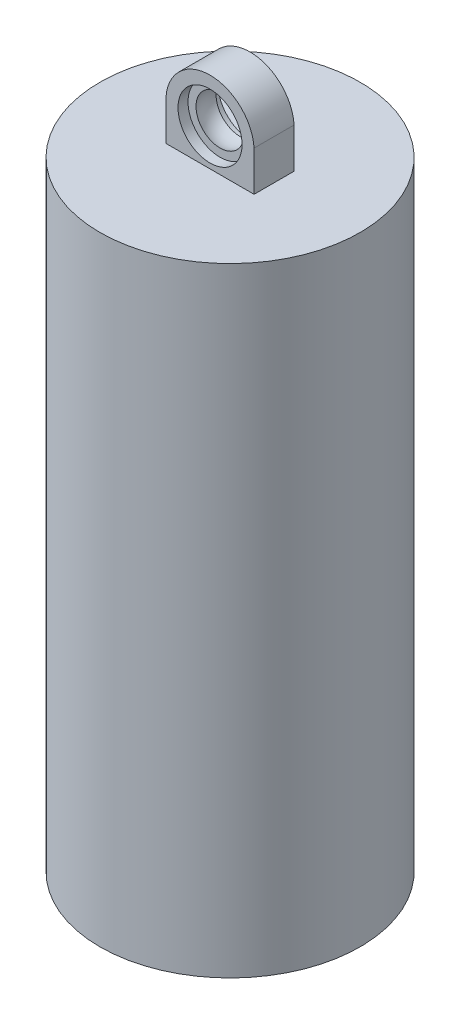
ISO-10303-21;
HEADER;
FILE_DESCRIPTION(('STEP AP214'),'2;1');
FILE_NAME('part.step','',(''),(''),'','','');
FILE_SCHEMA(('AUTOMOTIVE_DESIGN { 1 0 10303 214 1 1 1 1 }'));
ENDSEC;
DATA;
#1=APPLICATION_CONTEXT('core data for automotive mechanical design processes');
#2=APPLICATION_PROTOCOL_DEFINITION('international standard','automotive_design',2000,#1);
#3=PRODUCT_CONTEXT('',#1,'mechanical');
#4=PRODUCT('Part','Part','',(#3));
#5=PRODUCT_RELATED_PRODUCT_CATEGORY('part','',(#4));
#6=PRODUCT_DEFINITION_FORMATION('','',#4);
#7=PRODUCT_DEFINITION_CONTEXT('part definition',#1,'design');
#8=PRODUCT_DEFINITION('design','',#6,#7);
#9=PRODUCT_DEFINITION_SHAPE('','',#8);
#10=(LENGTH_UNIT() NAMED_UNIT(*) SI_UNIT(.MILLI.,.METRE.));
#11=(NAMED_UNIT(*) PLANE_ANGLE_UNIT() SI_UNIT($,.RADIAN.));
#12=(NAMED_UNIT(*) SI_UNIT($,.STERADIAN.) SOLID_ANGLE_UNIT());
#13=UNCERTAINTY_MEASURE_WITH_UNIT(LENGTH_MEASURE(1.E-05),#10,'distance_accuracy_value','');
#14=(GEOMETRIC_REPRESENTATION_CONTEXT(3) GLOBAL_UNCERTAINTY_ASSIGNED_CONTEXT((#13)) GLOBAL_UNIT_ASSIGNED_CONTEXT((#10,
#11,#12)) REPRESENTATION_CONTEXT('',''));
#15=CARTESIAN_POINT('',(0.,0.,0.));
#16=DIRECTION('',(0.,0.,1.));
#17=DIRECTION('',(1.,0.,0.));
#18=AXIS2_PLACEMENT_3D('',#15,#16,#17);
#19=CARTESIAN_POINT('',(0.,163.761335751218,-5.));
#20=DIRECTION('',(0.,0.,1.));
#21=DIRECTION('',(1.,0.,0.));
#22=AXIS2_PLACEMENT_3D('',#19,#20,#21);
#23=CYLINDRICAL_SURFACE('',#22,8.);
#24=CARTESIAN_POINT('',(0.,163.761335751218,-5.));
#25=DIRECTION('',(0.,0.,1.));
#26=DIRECTION('',(1.,0.,0.));
#27=AXIS2_PLACEMENT_3D('',#24,#25,#26);
#28=CIRCLE('',#27,8.);
#29=CARTESIAN_POINT('',(8.00000000000001,163.761335751218,-5.));
#30=VERTEX_POINT('',#29);
#31=EDGE_CURVE('E119',#30,#30,#28,.T.);
#32=ORIENTED_EDGE('',*,*,#31,.F.);
#33=EDGE_LOOP('',(#32));
#34=FACE_BOUND('',#33,.T.);
#35=CARTESIAN_POINT('',(0.,163.761335751218,-2.5));
#36=DIRECTION('',(0.,0.,1.));
#37=DIRECTION('',(1.,0.,0.));
#38=AXIS2_PLACEMENT_3D('',#35,#36,#37);
#39=CIRCLE('',#38,8.);
#40=CARTESIAN_POINT('',(8.00000000000001,163.761335751218,-2.5));
#41=VERTEX_POINT('',#40);
#42=EDGE_CURVE('E12',#41,#41,#39,.F.);
#43=ORIENTED_EDGE('',*,*,#42,.F.);
#44=EDGE_LOOP('',(#43));
#45=FACE_BOUND('',#44,.T.);
#46=ADVANCED_FACE('F44',(#34,#45),#23,.F.);
#47=CARTESIAN_POINT('',(0.,154.5,0.));
#48=DIRECTION('',(0.,-1.,0.));
#49=DIRECTION('',(0.,0.,-1.));
#50=AXIS2_PLACEMENT_3D('',#47,#48,#49);
#51=CYLINDRICAL_SURFACE('',#50,32.5);
#52=CARTESIAN_POINT('',(0.,154.5,0.));
#53=DIRECTION('',(0.,1.,0.));
#54=DIRECTION('',(0.,0.,1.));
#55=AXIS2_PLACEMENT_3D('',#52,#53,#54);
#56=CIRCLE('',#55,32.5);
#57=CARTESIAN_POINT('',(0.,154.5,32.5));
#58=VERTEX_POINT('',#57);
#59=EDGE_CURVE('E139',#58,#58,#56,.T.);
#60=ORIENTED_EDGE('',*,*,#59,.F.);
#61=EDGE_LOOP('',(#60));
#62=FACE_BOUND('',#61,.T.);
#63=CARTESIAN_POINT('',(0.,0.,0.));
#64=DIRECTION('',(0.,1.,0.));
#65=DIRECTION('',(0.,0.,1.));
#66=AXIS2_PLACEMENT_3D('',#63,#64,#65);
#67=CIRCLE('',#66,32.5);
#68=CARTESIAN_POINT('',(0.,0.,32.5));
#69=VERTEX_POINT('',#68);
#70=EDGE_CURVE('E136',#69,#69,#67,.T.);
#71=ORIENTED_EDGE('',*,*,#70,.T.);
#72=EDGE_LOOP('',(#71));
#73=FACE_BOUND('',#72,.T.);
#74=ADVANCED_FACE('F46',(#62,#73),#51,.T.);
#75=CARTESIAN_POINT('',(0.,154.5,0.));
#76=DIRECTION('',(0.,1.,0.));
#77=DIRECTION('',(0.,0.,1.));
#78=AXIS2_PLACEMENT_3D('',#75,#76,#77);
#79=PLANE('',#78);
#80=DIRECTION('',(1.,0.,0.));
#81=VECTOR('',#80,1.);
#82=CARTESIAN_POINT('',(-11.,154.5,5.));
#83=LINE('',#82,#81);
#84=CARTESIAN_POINT('',(-11.,154.5,5.));
#85=VERTEX_POINT('',#84);
#86=CARTESIAN_POINT('',(11.,154.5,5.));
#87=VERTEX_POINT('',#86);
#88=EDGE_CURVE('E59',#85,#87,#83,.T.);
#89=ORIENTED_EDGE('',*,*,#88,.F.);
#90=DIRECTION('',(0.,0.,1.));
#91=VECTOR('',#90,1.);
#92=CARTESIAN_POINT('',(-11.,154.5,-5.));
#93=LINE('',#92,#91);
#94=CARTESIAN_POINT('',(-11.,154.5,-5.));
#95=VERTEX_POINT('',#94);
#96=EDGE_CURVE('E102',#95,#85,#93,.T.);
#97=ORIENTED_EDGE('',*,*,#96,.F.);
#98=DIRECTION('',(1.,0.,0.));
#99=VECTOR('',#98,1.);
#100=CARTESIAN_POINT('',(-11.,154.5,-5.));
#101=LINE('',#100,#99);
#102=CARTESIAN_POINT('',(11.,154.5,-5.));
#103=VERTEX_POINT('',#102);
#104=EDGE_CURVE('E90',#95,#103,#101,.T.);
#105=ORIENTED_EDGE('',*,*,#104,.T.);
#106=DIRECTION('',(0.,0.,1.));
#107=VECTOR('',#106,1.);
#108=CARTESIAN_POINT('',(11.,154.5,-5.));
#109=LINE('',#108,#107);
#110=EDGE_CURVE('E95',#103,#87,#109,.T.);
#111=ORIENTED_EDGE('',*,*,#110,.T.);
#112=EDGE_LOOP('',(#89,#97,#105,#111));
#113=FACE_BOUND('',#112,.T.);
#114=ORIENTED_EDGE('',*,*,#59,.T.);
#115=EDGE_LOOP('',(#114));
#116=FACE_BOUND('',#115,.T.);
#117=ADVANCED_FACE('F108',(#113,#116),#79,.T.);
#118=CARTESIAN_POINT('',(0.,0.,0.));
#119=DIRECTION('',(0.,1.,0.));
#120=DIRECTION('',(0.,0.,1.));
#121=AXIS2_PLACEMENT_3D('',#118,#119,#120);
#122=PLANE('',#121);
#123=CARTESIAN_POINT('',(0.,0.,0.));
#124=DIRECTION('',(0.,-1.,0.));
#125=DIRECTION('',(0.,0.,-1.));
#126=AXIS2_PLACEMENT_3D('',#123,#124,#125);
#127=CIRCLE('',#126,12.5);
#128=CARTESIAN_POINT('',(0.,0.,-12.5));
#129=VERTEX_POINT('',#128);
#130=EDGE_CURVE('E52',#129,#129,#127,.T.);
#131=ORIENTED_EDGE('',*,*,#130,.F.);
#132=EDGE_LOOP('',(#131));
#133=FACE_BOUND('',#132,.T.);
#134=ORIENTED_EDGE('',*,*,#70,.F.);
#135=EDGE_LOOP('',(#134));
#136=FACE_BOUND('',#135,.T.);
#137=ADVANCED_FACE('F145',(#133,#136),#122,.F.);
#138=CARTESIAN_POINT('',(0.,-6.,0.));
#139=DIRECTION('',(0.,1.,0.));
#140=DIRECTION('',(0.,0.,1.));
#141=AXIS2_PLACEMENT_3D('',#138,#139,#140);
#142=CYLINDRICAL_SURFACE('',#141,12.5);
#143=CARTESIAN_POINT('',(0.,-6.,0.));
#144=DIRECTION('',(0.,-1.,0.));
#145=DIRECTION('',(0.,0.,-1.));
#146=AXIS2_PLACEMENT_3D('',#143,#144,#145);
#147=CIRCLE('',#146,12.5);
#148=CARTESIAN_POINT('',(0.,-6.,-12.5));
#149=VERTEX_POINT('',#148);
#150=EDGE_CURVE('E131',#149,#149,#147,.T.);
#151=ORIENTED_EDGE('',*,*,#150,.F.);
#152=EDGE_LOOP('',(#151));
#153=FACE_BOUND('',#152,.T.);
#154=ORIENTED_EDGE('',*,*,#130,.T.);
#155=EDGE_LOOP('',(#154));
#156=FACE_BOUND('',#155,.T.);
#157=ADVANCED_FACE('F147',(#153,#156),#142,.T.);
#158=CARTESIAN_POINT('',(0.,-6.,0.));
#159=DIRECTION('',(0.,-1.,0.));
#160=DIRECTION('',(0.,0.,-1.));
#161=AXIS2_PLACEMENT_3D('',#158,#159,#160);
#162=PLANE('',#161);
#163=CARTESIAN_POINT('',(0.,-6.,0.));
#164=DIRECTION('',(0.,-1.,0.));
#165=DIRECTION('',(0.,0.,-1.));
#166=AXIS2_PLACEMENT_3D('',#163,#164,#165);
#167=CIRCLE('',#166,6.);
#168=CARTESIAN_POINT('',(0.,-6.,-6.));
#169=VERTEX_POINT('',#168);
#170=EDGE_CURVE('E125',#169,#169,#167,.T.);
#171=ORIENTED_EDGE('',*,*,#170,.F.);
#172=EDGE_LOOP('',(#171));
#173=FACE_BOUND('',#172,.T.);
#174=ORIENTED_EDGE('',*,*,#150,.T.);
#175=EDGE_LOOP('',(#174));
#176=FACE_BOUND('',#175,.T.);
#177=ADVANCED_FACE('F153',(#173,#176),#162,.T.);
#178=CARTESIAN_POINT('',(0.,74.,0.));
#179=DIRECTION('',(0.,-1.,0.));
#180=DIRECTION('',(0.,0.,-1.));
#181=AXIS2_PLACEMENT_3D('',#178,#179,#180);
#182=CYLINDRICAL_SURFACE('',#181,6.);
#183=CARTESIAN_POINT('',(0.,74.,0.));
#184=DIRECTION('',(0.,-1.,0.));
#185=DIRECTION('',(0.,0.,-1.));
#186=AXIS2_PLACEMENT_3D('',#183,#184,#185);
#187=CIRCLE('',#186,6.);
#188=CARTESIAN_POINT('',(0.,74.,-6.));
#189=VERTEX_POINT('',#188);
#190=EDGE_CURVE('E128',#189,#189,#187,.T.);
#191=ORIENTED_EDGE('',*,*,#190,.F.);
#192=EDGE_LOOP('',(#191));
#193=FACE_BOUND('',#192,.T.);
#194=ORIENTED_EDGE('',*,*,#170,.T.);
#195=EDGE_LOOP('',(#194));
#196=FACE_BOUND('',#195,.T.);
#197=ADVANCED_FACE('F280',(#193,#196),#182,.F.);
#198=CARTESIAN_POINT('',(0.,74.,0.));
#199=DIRECTION('',(0.,-1.,0.));
#200=DIRECTION('',(0.,0.,-1.));
#201=AXIS2_PLACEMENT_3D('',#198,#199,#200);
#202=PLANE('',#201);
#203=ORIENTED_EDGE('',*,*,#190,.T.);
#204=EDGE_LOOP('',(#203));
#205=FACE_BOUND('',#204,.T.);
#206=ADVANCED_FACE('F271',(#205),#202,.T.);
#207=CARTESIAN_POINT('',(-11.,154.5,-5.));
#208=DIRECTION('',(-1.,0.,0.));
#209=DIRECTION('',(0.,-1.,0.));
#210=AXIS2_PLACEMENT_3D('',#207,#208,#209);
#211=PLANE('',#210);
#212=DIRECTION('',(0.,-1.,0.));
#213=VECTOR('',#212,1.);
#214=CARTESIAN_POINT('',(-11.,154.5,5.));
#215=LINE('',#214,#213);
#216=CARTESIAN_POINT('',(-11.,164.5,5.));
#217=VERTEX_POINT('',#216);
#218=EDGE_CURVE('E117',#217,#85,#215,.T.);
#219=ORIENTED_EDGE('',*,*,#218,.F.);
#220=DIRECTION('',(0.,0.,1.));
#221=VECTOR('',#220,1.);
#222=CARTESIAN_POINT('',(-11.,164.5,-5.));
#223=LINE('',#222,#221);
#224=CARTESIAN_POINT('',(-11.,164.5,-5.));
#225=VERTEX_POINT('',#224);
#226=EDGE_CURVE('E68',#225,#217,#223,.T.);
#227=ORIENTED_EDGE('',*,*,#226,.F.);
#228=DIRECTION('',(0.,-1.,0.));
#229=VECTOR('',#228,1.);
#230=CARTESIAN_POINT('',(-11.,154.5,-5.));
#231=LINE('',#230,#229);
#232=EDGE_CURVE('E110',#225,#95,#231,.T.);
#233=ORIENTED_EDGE('',*,*,#232,.T.);
#234=ORIENTED_EDGE('',*,*,#96,.T.);
#235=EDGE_LOOP('',(#219,#227,#233,#234));
#236=FACE_BOUND('',#235,.T.);
#237=ADVANCED_FACE('F263',(#236),#211,.T.);
#238=CARTESIAN_POINT('',(0.,163.761335751218,-5.));
#239=DIRECTION('',(0.,0.,1.));
#240=DIRECTION('',(1.,0.,0.));
#241=AXIS2_PLACEMENT_3D('',#238,#239,#240);
#242=CYLINDRICAL_SURFACE('',#241,11.0247732345127);
#243=CARTESIAN_POINT('',(0.,163.761335751218,5.));
#244=DIRECTION('',(0.,0.,1.));
#245=DIRECTION('',(-1.,0.,0.));
#246=AXIS2_PLACEMENT_3D('',#243,#244,#245);
#247=CIRCLE('',#246,11.0247732345127);
#248=CARTESIAN_POINT('',(11.,164.5,5.));
#249=VERTEX_POINT('',#248);
#250=EDGE_CURVE('E112',#249,#217,#247,.T.);
#251=ORIENTED_EDGE('',*,*,#250,.F.);
#252=DIRECTION('',(0.,0.,1.));
#253=VECTOR('',#252,1.);
#254=CARTESIAN_POINT('',(11.,164.5,-5.));
#255=LINE('',#254,#253);
#256=CARTESIAN_POINT('',(11.,164.5,-5.));
#257=VERTEX_POINT('',#256);
#258=EDGE_CURVE('E101',#257,#249,#255,.T.);
#259=ORIENTED_EDGE('',*,*,#258,.F.);
#260=CARTESIAN_POINT('',(0.,163.761335751218,-5.));
#261=DIRECTION('',(0.,0.,1.));
#262=DIRECTION('',(-1.,0.,0.));
#263=AXIS2_PLACEMENT_3D('',#260,#261,#262);
#264=CIRCLE('',#263,11.0247732345127);
#265=EDGE_CURVE('E105',#257,#225,#264,.T.);
#266=ORIENTED_EDGE('',*,*,#265,.T.);
#267=ORIENTED_EDGE('',*,*,#226,.T.);
#268=EDGE_LOOP('',(#251,#259,#266,#267));
#269=FACE_BOUND('',#268,.T.);
#270=ADVANCED_FACE('F255',(#269),#242,.T.);
#271=CARTESIAN_POINT('',(11.,154.5,-5.));
#272=DIRECTION('',(1.,0.,0.));
#273=DIRECTION('',(0.,1.,0.));
#274=AXIS2_PLACEMENT_3D('',#271,#272,#273);
#275=PLANE('',#274);
#276=DIRECTION('',(0.,1.,0.));
#277=VECTOR('',#276,1.);
#278=CARTESIAN_POINT('',(11.,154.5,5.));
#279=LINE('',#278,#277);
#280=EDGE_CURVE('E99',#87,#249,#279,.T.);
#281=ORIENTED_EDGE('',*,*,#280,.F.);
#282=ORIENTED_EDGE('',*,*,#110,.F.);
#283=DIRECTION('',(0.,1.,0.));
#284=VECTOR('',#283,1.);
#285=CARTESIAN_POINT('',(11.,154.5,-5.));
#286=LINE('',#285,#284);
#287=EDGE_CURVE('E97',#103,#257,#286,.T.);
#288=ORIENTED_EDGE('',*,*,#287,.T.);
#289=ORIENTED_EDGE('',*,*,#258,.T.);
#290=EDGE_LOOP('',(#281,#282,#288,#289));
#291=FACE_BOUND('',#290,.T.);
#292=ADVANCED_FACE('F96',(#291),#275,.T.);
#293=CARTESIAN_POINT('',(0.,163.761335751218,-5.));
#294=DIRECTION('',(0.,0.,-1.));
#295=DIRECTION('',(-1.,0.,0.));
#296=AXIS2_PLACEMENT_3D('',#293,#294,#295);
#297=PLANE('',#296);
#298=ORIENTED_EDGE('',*,*,#31,.T.);
#299=EDGE_LOOP('',(#298));
#300=FACE_BOUND('',#299,.T.);
#301=ORIENTED_EDGE('',*,*,#232,.F.);
#302=ORIENTED_EDGE('',*,*,#265,.F.);
#303=ORIENTED_EDGE('',*,*,#287,.F.);
#304=ORIENTED_EDGE('',*,*,#104,.F.);
#305=EDGE_LOOP('',(#301,#302,#303,#304));
#306=FACE_BOUND('',#305,.T.);
#307=ADVANCED_FACE('F104',(#300,#306),#297,.T.);
#308=CARTESIAN_POINT('',(0.,163.761335751218,5.));
#309=DIRECTION('',(0.,0.,-1.));
#310=DIRECTION('',(-1.,0.,0.));
#311=AXIS2_PLACEMENT_3D('',#308,#309,#310);
#312=PLANE('',#311);
#313=CARTESIAN_POINT('',(0.,163.761335751218,5.));
#314=DIRECTION('',(0.,0.,1.));
#315=DIRECTION('',(1.,0.,0.));
#316=AXIS2_PLACEMENT_3D('',#313,#314,#315);
#317=CIRCLE('',#316,8.);
#318=CARTESIAN_POINT('',(8.00000000000001,163.761335751218,5.));
#319=VERTEX_POINT('',#318);
#320=EDGE_CURVE('E188',#319,#319,#317,.T.);
#321=ORIENTED_EDGE('',*,*,#320,.F.);
#322=EDGE_LOOP('',(#321));
#323=FACE_BOUND('',#322,.T.);
#324=ORIENTED_EDGE('',*,*,#218,.T.);
#325=ORIENTED_EDGE('',*,*,#88,.T.);
#326=ORIENTED_EDGE('',*,*,#280,.T.);
#327=ORIENTED_EDGE('',*,*,#250,.T.);
#328=EDGE_LOOP('',(#324,#325,#326,#327));
#329=FACE_BOUND('',#328,.T.);
#330=ADVANCED_FACE('F172',(#323,#329),#312,.F.);
#331=CARTESIAN_POINT('',(0.,163.761335751218,2.5));
#332=DIRECTION('',(0.,0.,1.));
#333=DIRECTION('',(1.,0.,0.));
#334=AXIS2_PLACEMENT_3D('',#331,#332,#333);
#335=CIRCLE('',#334,8.);
#336=CARTESIAN_POINT('',(8.00000000000001,163.761335751218,2.5));
#337=VERTEX_POINT('',#336);
#338=EDGE_CURVE('E185',#337,#337,#335,.T.);
#339=ORIENTED_EDGE('',*,*,#338,.F.);
#340=EDGE_LOOP('',(#339));
#341=FACE_BOUND('',#340,.T.);
#342=ORIENTED_EDGE('',*,*,#320,.T.);
#343=EDGE_LOOP('',(#342));
#344=FACE_BOUND('',#343,.T.);
#345=ADVANCED_FACE('F161',(#341,#344),#23,.F.);
#346=CARTESIAN_POINT('',(0.,163.761335751218,-2.5));
#347=DIRECTION('',(0.,0.,1.));
#348=DIRECTION('',(1.,0.,0.));
#349=AXIS2_PLACEMENT_3D('',#346,#347,#348);
#350=PLANE('',#349);
#351=CARTESIAN_POINT('',(0.,163.761335751218,-2.5));
#352=DIRECTION('',(0.,0.,1.));
#353=DIRECTION('',(1.,0.,0.));
#354=AXIS2_PLACEMENT_3D('',#351,#352,#353);
#355=CIRCLE('',#354,6.00000000000001);
#356=CARTESIAN_POINT('',(6.00000000000001,163.761335751218,-2.5));
#357=VERTEX_POINT('',#356);
#358=EDGE_CURVE('E196',#357,#357,#355,.F.);
#359=ORIENTED_EDGE('',*,*,#358,.F.);
#360=EDGE_LOOP('',(#359));
#361=FACE_BOUND('',#360,.T.);
#362=ORIENTED_EDGE('',*,*,#42,.T.);
#363=EDGE_LOOP('',(#362));
#364=FACE_BOUND('',#363,.T.);
#365=ADVANCED_FACE('F171',(#361,#364),#350,.F.);
#366=CARTESIAN_POINT('',(0.,163.761335751218,2.5));
#367=DIRECTION('',(0.,0.,1.));
#368=DIRECTION('',(1.,0.,0.));
#369=AXIS2_PLACEMENT_3D('',#366,#367,#368);
#370=PLANE('',#369);
#371=CARTESIAN_POINT('',(0.,163.761335751218,2.5));
#372=DIRECTION('',(0.,0.,-1.));
#373=DIRECTION('',(-1.,0.,0.));
#374=AXIS2_PLACEMENT_3D('',#371,#372,#373);
#375=CIRCLE('',#374,6.00000000000001);
#376=CARTESIAN_POINT('',(-6.,163.761335751218,2.5));
#377=VERTEX_POINT('',#376);
#378=EDGE_CURVE('E191',#377,#377,#375,.F.);
#379=ORIENTED_EDGE('',*,*,#378,.F.);
#380=EDGE_LOOP('',(#379));
#381=FACE_BOUND('',#380,.T.);
#382=ORIENTED_EDGE('',*,*,#338,.T.);
#383=EDGE_LOOP('',(#382));
#384=FACE_BOUND('',#383,.T.);
#385=ADVANCED_FACE('F178',(#381,#384),#370,.T.);
#386=CARTESIAN_POINT('',(0.,163.761335751218,0.));
#387=DIRECTION('',(0.,1.,0.));
#388=DIRECTION('',(-1.,0.,0.));
#389=AXIS2_PLACEMENT_3D('',#386,#387,#388);
#390=SPHERICAL_SURFACE('',#389,6.50000000000001);
#391=CARTESIAN_POINT('',(0.,163.761335751218,0.));
#392=DIRECTION('',(0.,0.,1.));
#393=DIRECTION('',(1.,0.,0.));
#394=AXIS2_PLACEMENT_3D('',#391,#392,#393);
#395=SPHERICAL_SURFACE('',#394,6.50000000000001);
#396=ORIENTED_EDGE('',*,*,#358,.T.);
#397=EDGE_LOOP('',(#396));
#398=FACE_BOUND('',#397,.T.);
#399=ORIENTED_EDGE('',*,*,#378,.T.);
#400=EDGE_LOOP('',(#399));
#401=FACE_BOUND('',#400,.T.);
#402=ADVANCED_FACE('F200',(#398,#401),#395,.F.);
#403=CLOSED_SHELL('',(#46,#74,#117,#137,#157,#177,#197,#206,#237,#270,#292,#307,#330,#345,#365,
#385,#402));
#404=MANIFOLD_SOLID_BREP('B2',#403);
#405=ADVANCED_BREP_SHAPE_REPRESENTATION('',(#18,#404),#14);
#406=SHAPE_DEFINITION_REPRESENTATION(#9,#405);
ENDSEC;
END-ISO-10303-21;
